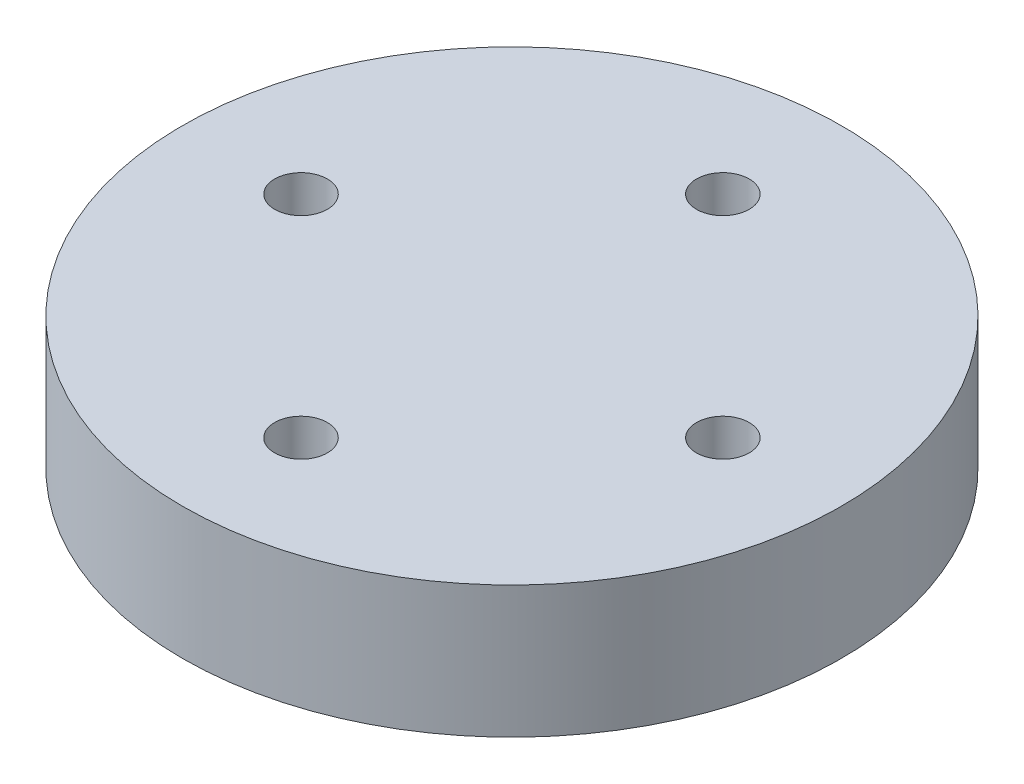
ISO-10303-21;
HEADER;
FILE_DESCRIPTION(('STEP AP214'),'2;1');
FILE_NAME('part.step','',(''),(''),'','','');
FILE_SCHEMA(('AUTOMOTIVE_DESIGN { 1 0 10303 214 1 1 1 1 }'));
ENDSEC;
DATA;
#1=APPLICATION_CONTEXT('core data for automotive mechanical design processes');
#2=APPLICATION_PROTOCOL_DEFINITION('international standard','automotive_design',2000,#1);
#3=PRODUCT_CONTEXT('',#1,'mechanical');
#4=PRODUCT('Part','Part','',(#3));
#5=PRODUCT_RELATED_PRODUCT_CATEGORY('part','',(#4));
#6=PRODUCT_DEFINITION_FORMATION('','',#4);
#7=PRODUCT_DEFINITION_CONTEXT('part definition',#1,'design');
#8=PRODUCT_DEFINITION('design','',#6,#7);
#9=PRODUCT_DEFINITION_SHAPE('','',#8);
#10=(LENGTH_UNIT() NAMED_UNIT(*) SI_UNIT(.MILLI.,.METRE.));
#11=(NAMED_UNIT(*) PLANE_ANGLE_UNIT() SI_UNIT($,.RADIAN.));
#12=(NAMED_UNIT(*) SI_UNIT($,.STERADIAN.) SOLID_ANGLE_UNIT());
#13=UNCERTAINTY_MEASURE_WITH_UNIT(LENGTH_MEASURE(1.E-05),#10,'distance_accuracy_value','');
#14=(GEOMETRIC_REPRESENTATION_CONTEXT(3) GLOBAL_UNCERTAINTY_ASSIGNED_CONTEXT((#13)) GLOBAL_UNIT_ASSIGNED_CONTEXT((#10,
#11,#12)) REPRESENTATION_CONTEXT('',''));
#15=CARTESIAN_POINT('',(0.,0.,0.));
#16=DIRECTION('',(0.,0.,1.));
#17=DIRECTION('',(1.,0.,0.));
#18=AXIS2_PLACEMENT_3D('',#15,#16,#17);
#19=CARTESIAN_POINT('',(0.,5.,0.));
#20=DIRECTION('',(0.,-1.,0.));
#21=DIRECTION('',(0.,0.,-1.));
#22=AXIS2_PLACEMENT_3D('',#19,#20,#21);
#23=CYLINDRICAL_SURFACE('',#22,12.5);
#24=CARTESIAN_POINT('',(0.,5.,0.));
#25=DIRECTION('',(0.,1.,0.));
#26=DIRECTION('',(0.,0.,1.));
#27=AXIS2_PLACEMENT_3D('',#24,#25,#26);
#28=CIRCLE('',#27,12.5);
#29=CARTESIAN_POINT('',(0.,5.,12.5));
#30=VERTEX_POINT('',#29);
#31=EDGE_CURVE('E10',#30,#30,#28,.T.);
#32=ORIENTED_EDGE('',*,*,#31,.F.);
#33=EDGE_LOOP('',(#32));
#34=FACE_BOUND('',#33,.T.);
#35=CARTESIAN_POINT('',(0.,0.,0.));
#36=DIRECTION('',(0.,1.,0.));
#37=DIRECTION('',(0.,0.,1.));
#38=AXIS2_PLACEMENT_3D('',#35,#36,#37);
#39=CIRCLE('',#38,12.5);
#40=CARTESIAN_POINT('',(0.,0.,12.5));
#41=VERTEX_POINT('',#40);
#42=EDGE_CURVE('E42',#41,#41,#39,.T.);
#43=ORIENTED_EDGE('',*,*,#42,.T.);
#44=EDGE_LOOP('',(#43));
#45=FACE_BOUND('',#44,.T.);
#46=ADVANCED_FACE('F39',(#34,#45),#23,.T.);
#47=CARTESIAN_POINT('',(0.,5.,0.));
#48=DIRECTION('',(0.,1.,0.));
#49=DIRECTION('',(0.,0.,1.));
#50=AXIS2_PLACEMENT_3D('',#47,#48,#49);
#51=PLANE('',#50);
#52=CARTESIAN_POINT('',(0.,5.,-8.));
#53=DIRECTION('',(0.,1.,0.));
#54=DIRECTION('',(0.,0.,1.));
#55=AXIS2_PLACEMENT_3D('',#52,#53,#54);
#56=CIRCLE('',#55,1.);
#57=CARTESIAN_POINT('',(0.,5.,-7.));
#58=VERTEX_POINT('',#57);
#59=EDGE_CURVE('E69',#58,#58,#56,.T.);
#60=ORIENTED_EDGE('',*,*,#59,.F.);
#61=EDGE_LOOP('',(#60));
#62=FACE_BOUND('',#61,.T.);
#63=CARTESIAN_POINT('',(8.00000000000023,5.,-2.25904099284255E-13));
#64=DIRECTION('',(0.,1.,0.));
#65=DIRECTION('',(0.,0.,1.));
#66=AXIS2_PLACEMENT_3D('',#63,#64,#65);
#67=CIRCLE('',#66,1.00000000000018);
#68=CARTESIAN_POINT('',(8.00000000000023,5.,0.999999999999952));
#69=VERTEX_POINT('',#68);
#70=EDGE_CURVE('E66',#69,#69,#67,.T.);
#71=ORIENTED_EDGE('',*,*,#70,.F.);
#72=EDGE_LOOP('',(#71));
#73=FACE_BOUND('',#72,.T.);
#74=CARTESIAN_POINT('',(4.52359289628127E-13,5.,8.));
#75=DIRECTION('',(0.,1.,0.));
#76=DIRECTION('',(0.,0.,1.));
#77=AXIS2_PLACEMENT_3D('',#74,#75,#76);
#78=CIRCLE('',#77,1.00000000000049);
#79=CARTESIAN_POINT('',(4.52359289628127E-13,5.,9.00000000000049));
#80=VERTEX_POINT('',#79);
#81=EDGE_CURVE('E60',#80,#80,#78,.T.);
#82=ORIENTED_EDGE('',*,*,#81,.F.);
#83=EDGE_LOOP('',(#82));
#84=FACE_BOUND('',#83,.T.);
#85=CARTESIAN_POINT('',(-7.99999999999977,5.,2.26883816723573E-13));
#86=DIRECTION('',(0.,1.,0.));
#87=DIRECTION('',(0.,0.,1.));
#88=AXIS2_PLACEMENT_3D('',#85,#86,#87);
#89=CIRCLE('',#88,1.00000000000037);
#90=CARTESIAN_POINT('',(-7.99999999999977,5.,1.00000000000059));
#91=VERTEX_POINT('',#90);
#92=EDGE_CURVE('E54',#91,#91,#89,.T.);
#93=ORIENTED_EDGE('',*,*,#92,.F.);
#94=EDGE_LOOP('',(#93));
#95=FACE_BOUND('',#94,.T.);
#96=ORIENTED_EDGE('',*,*,#31,.T.);
#97=EDGE_LOOP('',(#96));
#98=FACE_BOUND('',#97,.T.);
#99=ADVANCED_FACE('F85',(#62,#73,#84,#95,#98),#51,.T.);
#100=CARTESIAN_POINT('',(0.,0.,0.));
#101=DIRECTION('',(0.,1.,0.));
#102=DIRECTION('',(0.,0.,1.));
#103=AXIS2_PLACEMENT_3D('',#100,#101,#102);
#104=PLANE('',#103);
#105=CARTESIAN_POINT('',(0.,0.,-8.));
#106=DIRECTION('',(0.,1.,0.));
#107=DIRECTION('',(0.,0.,1.));
#108=AXIS2_PLACEMENT_3D('',#105,#106,#107);
#109=CIRCLE('',#108,1.);
#110=CARTESIAN_POINT('',(0.,0.,-7.));
#111=VERTEX_POINT('',#110);
#112=EDGE_CURVE('E49',#111,#111,#109,.T.);
#113=ORIENTED_EDGE('',*,*,#112,.T.);
#114=EDGE_LOOP('',(#113));
#115=FACE_BOUND('',#114,.T.);
#116=CARTESIAN_POINT('',(8.00000000000023,0.,-2.25904099284255E-13));
#117=DIRECTION('',(0.,1.,0.));
#118=DIRECTION('',(0.,0.,1.));
#119=AXIS2_PLACEMENT_3D('',#116,#117,#118);
#120=CIRCLE('',#119,1.00000000000018);
#121=CARTESIAN_POINT('',(8.00000000000023,0.,0.999999999999952));
#122=VERTEX_POINT('',#121);
#123=EDGE_CURVE('E63',#122,#122,#120,.T.);
#124=ORIENTED_EDGE('',*,*,#123,.T.);
#125=EDGE_LOOP('',(#124));
#126=FACE_BOUND('',#125,.T.);
#127=CARTESIAN_POINT('',(4.52359289628127E-13,0.,8.));
#128=DIRECTION('',(0.,1.,0.));
#129=DIRECTION('',(0.,0.,1.));
#130=AXIS2_PLACEMENT_3D('',#127,#128,#129);
#131=CIRCLE('',#130,1.00000000000049);
#132=CARTESIAN_POINT('',(4.52359289628127E-13,0.,9.00000000000049));
#133=VERTEX_POINT('',#132);
#134=EDGE_CURVE('E57',#133,#133,#131,.T.);
#135=ORIENTED_EDGE('',*,*,#134,.T.);
#136=EDGE_LOOP('',(#135));
#137=FACE_BOUND('',#136,.T.);
#138=CARTESIAN_POINT('',(-7.99999999999977,0.,2.26883816723573E-13));
#139=DIRECTION('',(0.,1.,0.));
#140=DIRECTION('',(0.,0.,1.));
#141=AXIS2_PLACEMENT_3D('',#138,#139,#140);
#142=CIRCLE('',#141,1.00000000000037);
#143=CARTESIAN_POINT('',(-7.99999999999977,0.,1.00000000000059));
#144=VERTEX_POINT('',#143);
#145=EDGE_CURVE('E51',#144,#144,#142,.T.);
#146=ORIENTED_EDGE('',*,*,#145,.T.);
#147=EDGE_LOOP('',(#146));
#148=FACE_BOUND('',#147,.T.);
#149=ORIENTED_EDGE('',*,*,#42,.F.);
#150=EDGE_LOOP('',(#149));
#151=FACE_BOUND('',#150,.T.);
#152=ADVANCED_FACE('F75',(#115,#126,#137,#148,#151),#104,.F.);
#153=CARTESIAN_POINT('',(-7.99999999999977,0.,2.26883816723573E-13));
#154=DIRECTION('',(0.,1.,0.));
#155=DIRECTION('',(0.,0.,1.));
#156=AXIS2_PLACEMENT_3D('',#153,#154,#155);
#157=CYLINDRICAL_SURFACE('',#156,1.00000000000037);
#158=ORIENTED_EDGE('',*,*,#145,.F.);
#159=EDGE_LOOP('',(#158));
#160=FACE_BOUND('',#159,.T.);
#161=ORIENTED_EDGE('',*,*,#92,.T.);
#162=EDGE_LOOP('',(#161));
#163=FACE_BOUND('',#162,.T.);
#164=ADVANCED_FACE('F95',(#160,#163),#157,.F.);
#165=CARTESIAN_POINT('',(4.52359289628127E-13,0.,8.));
#166=DIRECTION('',(0.,1.,0.));
#167=DIRECTION('',(0.,0.,1.));
#168=AXIS2_PLACEMENT_3D('',#165,#166,#167);
#169=CYLINDRICAL_SURFACE('',#168,1.00000000000049);
#170=ORIENTED_EDGE('',*,*,#134,.F.);
#171=EDGE_LOOP('',(#170));
#172=FACE_BOUND('',#171,.T.);
#173=ORIENTED_EDGE('',*,*,#81,.T.);
#174=EDGE_LOOP('',(#173));
#175=FACE_BOUND('',#174,.T.);
#176=ADVANCED_FACE('F97',(#172,#175),#169,.F.);
#177=CARTESIAN_POINT('',(8.00000000000023,0.,-2.25904099284255E-13));
#178=DIRECTION('',(0.,1.,0.));
#179=DIRECTION('',(0.,0.,1.));
#180=AXIS2_PLACEMENT_3D('',#177,#178,#179);
#181=CYLINDRICAL_SURFACE('',#180,1.00000000000018);
#182=ORIENTED_EDGE('',*,*,#123,.F.);
#183=EDGE_LOOP('',(#182));
#184=FACE_BOUND('',#183,.T.);
#185=ORIENTED_EDGE('',*,*,#70,.T.);
#186=EDGE_LOOP('',(#185));
#187=FACE_BOUND('',#186,.T.);
#188=ADVANCED_FACE('F81',(#184,#187),#181,.F.);
#189=CARTESIAN_POINT('',(0.,0.,-8.));
#190=DIRECTION('',(0.,1.,0.));
#191=DIRECTION('',(0.,0.,1.));
#192=AXIS2_PLACEMENT_3D('',#189,#190,#191);
#193=CYLINDRICAL_SURFACE('',#192,1.);
#194=ORIENTED_EDGE('',*,*,#112,.F.);
#195=EDGE_LOOP('',(#194));
#196=FACE_BOUND('',#195,.T.);
#197=ORIENTED_EDGE('',*,*,#59,.T.);
#198=EDGE_LOOP('',(#197));
#199=FACE_BOUND('',#198,.T.);
#200=ADVANCED_FACE('F78',(#196,#199),#193,.F.);
#201=CLOSED_SHELL('',(#46,#99,#152,#164,#176,#188,#200));
#202=MANIFOLD_SOLID_BREP('B2',#201);
#203=ADVANCED_BREP_SHAPE_REPRESENTATION('',(#18,#202),#14);
#204=SHAPE_DEFINITION_REPRESENTATION(#9,#203);
ENDSEC;
END-ISO-10303-21;
